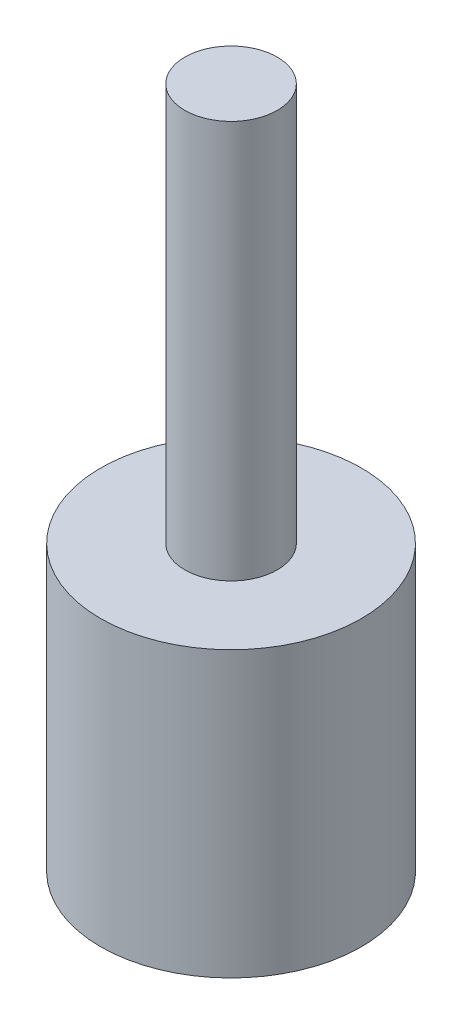
ISO-10303-21;
HEADER;
FILE_DESCRIPTION(('STEP AP214'),'2;1');
FILE_NAME('part.step','',(''),(''),'','','');
FILE_SCHEMA(('AUTOMOTIVE_DESIGN { 1 0 10303 214 1 1 1 1 }'));
ENDSEC;
DATA;
#1=APPLICATION_CONTEXT('core data for automotive mechanical design processes');
#2=APPLICATION_PROTOCOL_DEFINITION('international standard','automotive_design',2000,#1);
#3=PRODUCT_CONTEXT('',#1,'mechanical');
#4=PRODUCT('Part','Part','',(#3));
#5=PRODUCT_RELATED_PRODUCT_CATEGORY('part','',(#4));
#6=PRODUCT_DEFINITION_FORMATION('','',#4);
#7=PRODUCT_DEFINITION_CONTEXT('part definition',#1,'design');
#8=PRODUCT_DEFINITION('design','',#6,#7);
#9=PRODUCT_DEFINITION_SHAPE('','',#8);
#10=(LENGTH_UNIT() NAMED_UNIT(*) SI_UNIT(.MILLI.,.METRE.));
#11=(NAMED_UNIT(*) PLANE_ANGLE_UNIT() SI_UNIT($,.RADIAN.));
#12=(NAMED_UNIT(*) SI_UNIT($,.STERADIAN.) SOLID_ANGLE_UNIT());
#13=UNCERTAINTY_MEASURE_WITH_UNIT(LENGTH_MEASURE(1.E-05),#10,'distance_accuracy_value','');
#14=(GEOMETRIC_REPRESENTATION_CONTEXT(3) GLOBAL_UNCERTAINTY_ASSIGNED_CONTEXT((#13)) GLOBAL_UNIT_ASSIGNED_CONTEXT((#10,
#11,#12)) REPRESENTATION_CONTEXT('',''));
#15=CARTESIAN_POINT('',(0.,0.,0.));
#16=DIRECTION('',(0.,0.,1.));
#17=DIRECTION('',(1.,0.,0.));
#18=AXIS2_PLACEMENT_3D('',#15,#16,#17);
#19=CARTESIAN_POINT('',(0.,45.9508188695463,0.));
#20=DIRECTION('',(0.,-1.,0.));
#21=DIRECTION('',(0.,0.,-1.));
#22=AXIS2_PLACEMENT_3D('',#19,#20,#21);
#23=CYLINDRICAL_SURFACE('',#22,9.175);
#24=CARTESIAN_POINT('',(0.,0.,0.));
#25=DIRECTION('',(0.,1.,0.));
#26=DIRECTION('',(0.,0.,1.));
#27=AXIS2_PLACEMENT_3D('',#24,#25,#26);
#28=CIRCLE('',#27,9.175);
#29=CARTESIAN_POINT('',(0.,0.,9.175));
#30=VERTEX_POINT('',#29);
#31=EDGE_CURVE('E43',#30,#30,#28,.T.);
#32=ORIENTED_EDGE('',*,*,#31,.T.);
#33=EDGE_LOOP('',(#32));
#34=FACE_BOUND('',#33,.T.);
#35=CARTESIAN_POINT('',(0.,20.,0.));
#36=DIRECTION('',(0.,1.,0.));
#37=DIRECTION('',(0.,0.,1.));
#38=AXIS2_PLACEMENT_3D('',#35,#36,#37);
#39=CIRCLE('',#38,9.175);
#40=CARTESIAN_POINT('',(0.,20.,9.175));
#41=VERTEX_POINT('',#40);
#42=EDGE_CURVE('E35',#41,#41,#39,.T.);
#43=ORIENTED_EDGE('',*,*,#42,.F.);
#44=EDGE_LOOP('',(#43));
#45=FACE_BOUND('',#44,.T.);
#46=ADVANCED_FACE('F31',(#34,#45),#23,.T.);
#47=CARTESIAN_POINT('',(0.,0.,0.));
#48=DIRECTION('',(0.,1.,0.));
#49=DIRECTION('',(0.,0.,1.));
#50=AXIS2_PLACEMENT_3D('',#47,#48,#49);
#51=PLANE('',#50);
#52=CARTESIAN_POINT('',(0.,0.,0.));
#53=DIRECTION('',(0.,-1.,0.));
#54=DIRECTION('',(0.,0.,-1.));
#55=AXIS2_PLACEMENT_3D('',#52,#53,#54);
#56=CIRCLE('',#55,3.175);
#57=CARTESIAN_POINT('',(0.,0.,-3.175));
#58=VERTEX_POINT('',#57);
#59=EDGE_CURVE('E55',#58,#58,#56,.T.);
#60=ORIENTED_EDGE('',*,*,#59,.F.);
#61=EDGE_LOOP('',(#60));
#62=FACE_BOUND('',#61,.T.);
#63=ORIENTED_EDGE('',*,*,#31,.F.);
#64=EDGE_LOOP('',(#63));
#65=FACE_BOUND('',#64,.T.);
#66=ADVANCED_FACE('F64',(#62,#65),#51,.F.);
#67=CARTESIAN_POINT('',(0.,20.,0.));
#68=DIRECTION('',(0.,1.,0.));
#69=DIRECTION('',(0.,0.,1.));
#70=AXIS2_PLACEMENT_3D('',#67,#68,#69);
#71=PLANE('',#70);
#72=CARTESIAN_POINT('',(0.,20.,0.));
#73=DIRECTION('',(0.,1.,0.));
#74=DIRECTION('',(0.,0.,1.));
#75=AXIS2_PLACEMENT_3D('',#72,#73,#74);
#76=CIRCLE('',#75,3.25);
#77=CARTESIAN_POINT('',(0.,20.,3.25));
#78=VERTEX_POINT('',#77);
#79=EDGE_CURVE('E10',#78,#78,#76,.T.);
#80=ORIENTED_EDGE('',*,*,#79,.F.);
#81=EDGE_LOOP('',(#80));
#82=FACE_BOUND('',#81,.T.);
#83=ORIENTED_EDGE('',*,*,#42,.T.);
#84=EDGE_LOOP('',(#83));
#85=FACE_BOUND('',#84,.T.);
#86=ADVANCED_FACE('F33',(#82,#85),#71,.T.);
#87=CARTESIAN_POINT('',(0.,48.,0.));
#88=DIRECTION('',(0.,-1.,0.));
#89=DIRECTION('',(0.,0.,-1.));
#90=AXIS2_PLACEMENT_3D('',#87,#88,#89);
#91=CYLINDRICAL_SURFACE('',#90,3.25);
#92=CARTESIAN_POINT('',(0.,48.,0.));
#93=DIRECTION('',(0.,1.,0.));
#94=DIRECTION('',(0.,0.,1.));
#95=AXIS2_PLACEMENT_3D('',#92,#93,#94);
#96=CIRCLE('',#95,3.25);
#97=CARTESIAN_POINT('',(0.,48.,3.25));
#98=VERTEX_POINT('',#97);
#99=EDGE_CURVE('E45',#98,#98,#96,.T.);
#100=ORIENTED_EDGE('',*,*,#99,.F.);
#101=EDGE_LOOP('',(#100));
#102=FACE_BOUND('',#101,.T.);
#103=ORIENTED_EDGE('',*,*,#79,.T.);
#104=EDGE_LOOP('',(#103));
#105=FACE_BOUND('',#104,.T.);
#106=ADVANCED_FACE('F72',(#102,#105),#91,.T.);
#107=CARTESIAN_POINT('',(0.,48.,0.));
#108=DIRECTION('',(0.,1.,0.));
#109=DIRECTION('',(0.,0.,1.));
#110=AXIS2_PLACEMENT_3D('',#107,#108,#109);
#111=PLANE('',#110);
#112=ORIENTED_EDGE('',*,*,#99,.T.);
#113=EDGE_LOOP('',(#112));
#114=FACE_BOUND('',#113,.T.);
#115=ADVANCED_FACE('F77',(#114),#111,.T.);
#116=CARTESIAN_POINT('',(0.,15.,0.));
#117=DIRECTION('',(0.,-1.,0.));
#118=DIRECTION('',(0.,0.,-1.));
#119=AXIS2_PLACEMENT_3D('',#116,#117,#118);
#120=CYLINDRICAL_SURFACE('',#119,3.175);
#121=CARTESIAN_POINT('',(0.,15.,0.));
#122=DIRECTION('',(0.,-1.,0.));
#123=DIRECTION('',(0.,0.,-1.));
#124=AXIS2_PLACEMENT_3D('',#121,#122,#123);
#125=CIRCLE('',#124,3.175);
#126=CARTESIAN_POINT('',(0.,15.,-3.175));
#127=VERTEX_POINT('',#126);
#128=EDGE_CURVE('E51',#127,#127,#125,.T.);
#129=ORIENTED_EDGE('',*,*,#128,.F.);
#130=EDGE_LOOP('',(#129));
#131=FACE_BOUND('',#130,.T.);
#132=ORIENTED_EDGE('',*,*,#59,.T.);
#133=EDGE_LOOP('',(#132));
#134=FACE_BOUND('',#133,.T.);
#135=ADVANCED_FACE('F62',(#131,#134),#120,.F.);
#136=CARTESIAN_POINT('',(0.,15.,0.));
#137=DIRECTION('',(0.,-1.,0.));
#138=DIRECTION('',(0.,0.,-1.));
#139=AXIS2_PLACEMENT_3D('',#136,#137,#138);
#140=PLANE('',#139);
#141=ORIENTED_EDGE('',*,*,#128,.T.);
#142=EDGE_LOOP('',(#141));
#143=FACE_BOUND('',#142,.T.);
#144=ADVANCED_FACE('F83',(#143),#140,.T.);
#145=CLOSED_SHELL('',(#46,#66,#86,#106,#115,#135,#144));
#146=MANIFOLD_SOLID_BREP('B2',#145);
#147=ADVANCED_BREP_SHAPE_REPRESENTATION('',(#18,#146),#14);
#148=SHAPE_DEFINITION_REPRESENTATION(#9,#147);
ENDSEC;
END-ISO-10303-21;
